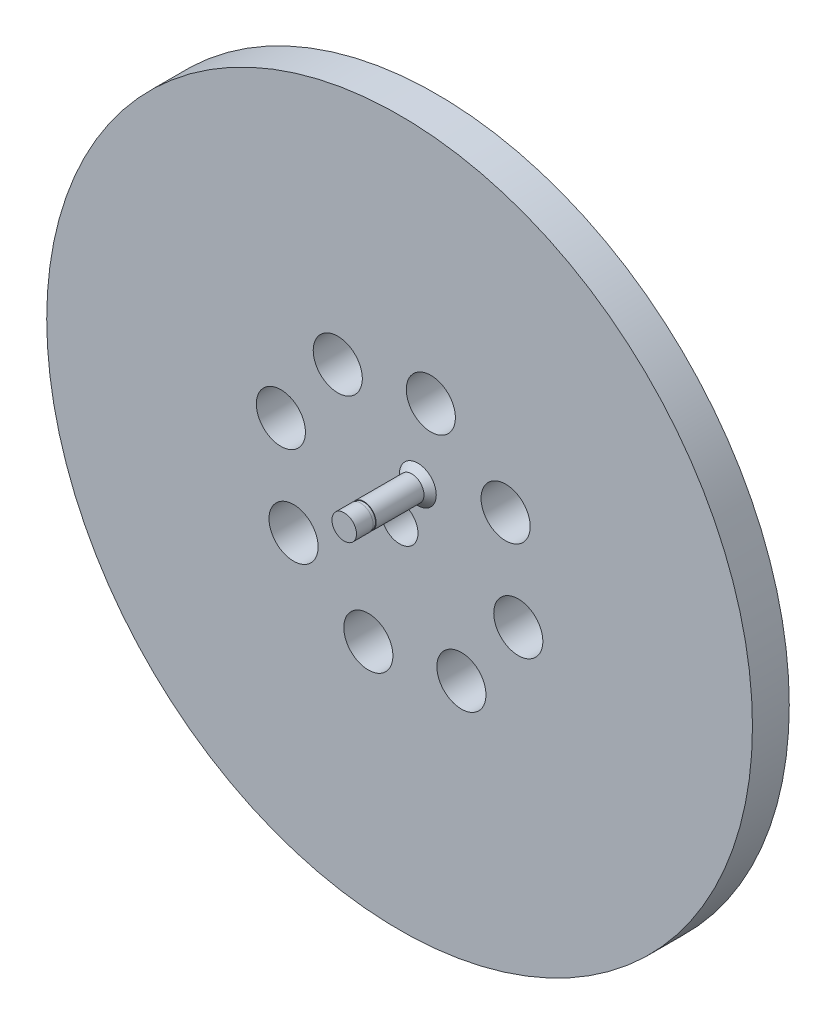
ISO-10303-21;
HEADER;
FILE_DESCRIPTION(('STEP AP214'),'2;1');
FILE_NAME('part.step','',(''),(''),'','','');
FILE_SCHEMA(('AUTOMOTIVE_DESIGN { 1 0 10303 214 1 1 1 1 }'));
ENDSEC;
DATA;
#1=APPLICATION_CONTEXT('core data for automotive mechanical design processes');
#2=APPLICATION_PROTOCOL_DEFINITION('international standard','automotive_design',2000,#1);
#3=PRODUCT_CONTEXT('',#1,'mechanical');
#4=PRODUCT('Part','Part','',(#3));
#5=PRODUCT_RELATED_PRODUCT_CATEGORY('part','',(#4));
#6=PRODUCT_DEFINITION_FORMATION('','',#4);
#7=PRODUCT_DEFINITION_CONTEXT('part definition',#1,'design');
#8=PRODUCT_DEFINITION('design','',#6,#7);
#9=PRODUCT_DEFINITION_SHAPE('','',#8);
#10=(LENGTH_UNIT() NAMED_UNIT(*) SI_UNIT(.MILLI.,.METRE.));
#11=(NAMED_UNIT(*) PLANE_ANGLE_UNIT() SI_UNIT($,.RADIAN.));
#12=(NAMED_UNIT(*) SI_UNIT($,.STERADIAN.) SOLID_ANGLE_UNIT());
#13=UNCERTAINTY_MEASURE_WITH_UNIT(LENGTH_MEASURE(1.E-05),#10,'distance_accuracy_value','');
#14=(GEOMETRIC_REPRESENTATION_CONTEXT(3) GLOBAL_UNCERTAINTY_ASSIGNED_CONTEXT((#13)) GLOBAL_UNIT_ASSIGNED_CONTEXT((#10,
#11,#12)) REPRESENTATION_CONTEXT('',''));
#15=CARTESIAN_POINT('',(0.,0.,0.));
#16=DIRECTION('',(0.,0.,1.));
#17=DIRECTION('',(1.,0.,0.));
#18=AXIS2_PLACEMENT_3D('',#15,#16,#17);
#19=CARTESIAN_POINT('',(2.97665947387337,6.88400307790459,18.));
#20=DIRECTION('',(0.,0.,-1.));
#21=DIRECTION('',(-1.,0.,0.));
#22=AXIS2_PLACEMENT_3D('',#19,#20,#21);
#23=CYLINDRICAL_SURFACE('',#22,2.);
#24=CARTESIAN_POINT('',(2.97665947387337,6.88400307790459,7.00000000000001));
#25=DIRECTION('',(0.,0.,1.));
#26=DIRECTION('',(1.,0.,0.));
#27=AXIS2_PLACEMENT_3D('',#24,#25,#26);
#28=CIRCLE('',#27,2.);
#29=CARTESIAN_POINT('',(4.97665947387337,6.88400307790459,7.00000000000001));
#30=VERTEX_POINT('',#29);
#31=EDGE_CURVE('E62',#30,#30,#28,.T.);
#32=ORIENTED_EDGE('',*,*,#31,.T.);
#33=EDGE_LOOP('',(#32));
#34=FACE_BOUND('',#33,.T.);
#35=CARTESIAN_POINT('',(2.97665947387337,6.88400307790459,14.8));
#36=DIRECTION('',(0.,0.,1.));
#37=DIRECTION('',(1.,0.,0.));
#38=AXIS2_PLACEMENT_3D('',#35,#36,#37);
#39=CIRCLE('',#38,2.);
#40=CARTESIAN_POINT('',(4.97665947387337,6.88400307790459,14.8));
#41=VERTEX_POINT('',#40);
#42=EDGE_CURVE('E159',#41,#41,#39,.T.);
#43=ORIENTED_EDGE('',*,*,#42,.F.);
#44=EDGE_LOOP('',(#43));
#45=FACE_BOUND('',#44,.T.);
#46=ADVANCED_FACE('F53',(#34,#45),#23,.T.);
#47=CARTESIAN_POINT('',(0.,0.,6.));
#48=DIRECTION('',(0.,0.,1.));
#49=DIRECTION('',(1.,0.,0.));
#50=AXIS2_PLACEMENT_3D('',#47,#48,#49);
#51=PLANE('',#50);
#52=CARTESIAN_POINT('',(2.97665947387337,6.88400307790459,6.));
#53=DIRECTION('',(0.,0.,1.));
#54=DIRECTION('',(1.,0.,0.));
#55=AXIS2_PLACEMENT_3D('',#52,#53,#54);
#56=CIRCLE('',#55,2.99999999999999);
#57=CARTESIAN_POINT('',(5.97665947387336,6.88400307790459,6.));
#58=VERTEX_POINT('',#57);
#59=EDGE_CURVE('E10',#58,#58,#56,.F.);
#60=ORIENTED_EDGE('',*,*,#59,.T.);
#61=EDGE_LOOP('',(#60));
#62=FACE_BOUND('',#61,.T.);
#63=CARTESIAN_POINT('',(17.2762876026621,10.0762039811679,6.));
#64=DIRECTION('',(0.,0.,-1.));
#65=DIRECTION('',(-1.,0.,0.));
#66=AXIS2_PLACEMENT_3D('',#63,#64,#65);
#67=CIRCLE('',#66,4.);
#68=CARTESIAN_POINT('',(13.2762876026621,10.0762039811679,6.));
#69=VERTEX_POINT('',#68);
#70=EDGE_CURVE('E99',#69,#69,#67,.T.);
#71=ORIENTED_EDGE('',*,*,#70,.T.);
#72=EDGE_LOOP('',(#71));
#73=FACE_BOUND('',#72,.T.);
#74=CARTESIAN_POINT('',(19.3411322812741,-5.0912279538688,6.));
#75=DIRECTION('',(0.,0.,-1.));
#76=DIRECTION('',(-1.,0.,0.));
#77=AXIS2_PLACEMENT_3D('',#74,#75,#76);
#78=CIRCLE('',#77,4.);
#79=CARTESIAN_POINT('',(15.3411322812741,-5.0912279538688,6.));
#80=VERTEX_POINT('',#79);
#81=EDGE_CURVE('E108',#80,#80,#78,.T.);
#82=ORIENTED_EDGE('',*,*,#81,.T.);
#83=EDGE_LOOP('',(#82));
#84=FACE_BOUND('',#83,.T.);
#85=CARTESIAN_POINT('',(10.0762039811678,-17.2762876026621,6.));
#86=DIRECTION('',(0.,0.,-1.));
#87=DIRECTION('',(-1.,0.,0.));
#88=AXIS2_PLACEMENT_3D('',#85,#86,#87);
#89=CIRCLE('',#88,4.);
#90=CARTESIAN_POINT('',(6.07620398116782,-17.2762876026621,6.));
#91=VERTEX_POINT('',#90);
#92=EDGE_CURVE('E116',#91,#91,#89,.T.);
#93=ORIENTED_EDGE('',*,*,#92,.T.);
#94=EDGE_LOOP('',(#93));
#95=FACE_BOUND('',#94,.T.);
#96=CARTESIAN_POINT('',(-5.09122795386886,-19.3411322812741,6.));
#97=DIRECTION('',(0.,0.,-1.));
#98=DIRECTION('',(-1.,0.,0.));
#99=AXIS2_PLACEMENT_3D('',#96,#97,#98);
#100=CIRCLE('',#99,4.);
#101=CARTESIAN_POINT('',(-9.09122795386886,-19.3411322812741,6.));
#102=VERTEX_POINT('',#101);
#103=EDGE_CURVE('E124',#102,#102,#100,.T.);
#104=ORIENTED_EDGE('',*,*,#103,.T.);
#105=EDGE_LOOP('',(#104));
#106=FACE_BOUND('',#105,.T.);
#107=CARTESIAN_POINT('',(-17.2762876026622,-10.0762039811678,6.));
#108=DIRECTION('',(0.,0.,-1.));
#109=DIRECTION('',(-1.,0.,0.));
#110=AXIS2_PLACEMENT_3D('',#107,#108,#109);
#111=CIRCLE('',#110,4.);
#112=CARTESIAN_POINT('',(-21.2762876026622,-10.0762039811678,6.));
#113=VERTEX_POINT('',#112);
#114=EDGE_CURVE('E132',#113,#113,#111,.T.);
#115=ORIENTED_EDGE('',*,*,#114,.T.);
#116=EDGE_LOOP('',(#115));
#117=FACE_BOUND('',#116,.T.);
#118=CARTESIAN_POINT('',(-19.3411322812741,5.09122795386893,6.));
#119=DIRECTION('',(0.,0.,-1.));
#120=DIRECTION('',(-1.,0.,0.));
#121=AXIS2_PLACEMENT_3D('',#118,#119,#120);
#122=CIRCLE('',#121,4.);
#123=CARTESIAN_POINT('',(-23.3411322812741,5.09122795386893,6.));
#124=VERTEX_POINT('',#123);
#125=EDGE_CURVE('E140',#124,#124,#122,.T.);
#126=ORIENTED_EDGE('',*,*,#125,.T.);
#127=EDGE_LOOP('',(#126));
#128=FACE_BOUND('',#127,.T.);
#129=CARTESIAN_POINT('',(-10.0762039811677,17.2762876026622,6.));
#130=DIRECTION('',(0.,0.,-1.));
#131=DIRECTION('',(-1.,0.,0.));
#132=AXIS2_PLACEMENT_3D('',#129,#130,#131);
#133=CIRCLE('',#132,4.);
#134=CARTESIAN_POINT('',(-14.0762039811677,17.2762876026622,6.));
#135=VERTEX_POINT('',#134);
#136=EDGE_CURVE('E148',#135,#135,#133,.T.);
#137=ORIENTED_EDGE('',*,*,#136,.T.);
#138=EDGE_LOOP('',(#137));
#139=FACE_BOUND('',#138,.T.);
#140=CARTESIAN_POINT('',(5.091227953869,19.3411322812741,6.));
#141=DIRECTION('',(0.,0.,-1.));
#142=DIRECTION('',(-1.,0.,0.));
#143=AXIS2_PLACEMENT_3D('',#140,#141,#142);
#144=CIRCLE('',#143,4.);
#145=CARTESIAN_POINT('',(1.091227953869,19.3411322812741,6.));
#146=VERTEX_POINT('',#145);
#147=EDGE_CURVE('E87',#146,#146,#144,.T.);
#148=ORIENTED_EDGE('',*,*,#147,.T.);
#149=EDGE_LOOP('',(#148));
#150=FACE_BOUND('',#149,.T.);
#151=CARTESIAN_POINT('',(0.,0.,6.));
#152=DIRECTION('',(0.,0.,1.));
#153=DIRECTION('',(1.,0.,0.));
#154=AXIS2_PLACEMENT_3D('',#151,#152,#153);
#155=CIRCLE('',#154,57.5);
#156=CARTESIAN_POINT('',(57.5,0.,6.));
#157=VERTEX_POINT('',#156);
#158=EDGE_CURVE('E69',#157,#157,#155,.T.);
#159=ORIENTED_EDGE('',*,*,#158,.T.);
#160=EDGE_LOOP('',(#159));
#161=FACE_BOUND('',#160,.T.);
#162=CARTESIAN_POINT('',(0.,0.,6.));
#163=DIRECTION('',(0.,0.,1.));
#164=DIRECTION('',(1.,0.,0.));
#165=AXIS2_PLACEMENT_3D('',#162,#163,#164);
#166=CIRCLE('',#165,3.);
#167=CARTESIAN_POINT('',(3.,0.,6.));
#168=VERTEX_POINT('',#167);
#169=EDGE_CURVE('E81',#168,#168,#166,.T.);
#170=ORIENTED_EDGE('',*,*,#169,.F.);
#171=EDGE_LOOP('',(#170));
#172=FACE_BOUND('',#171,.T.);
#173=ADVANCED_FACE('F198',(#62,#73,#84,#95,#106,#117,#128,#139,#150,#161,#172),#51,.T.);
#174=CARTESIAN_POINT('',(0.,0.,0.));
#175=DIRECTION('',(0.,0.,1.));
#176=DIRECTION('',(1.,0.,0.));
#177=AXIS2_PLACEMENT_3D('',#174,#175,#176);
#178=PLANE('',#177);
#179=CARTESIAN_POINT('',(17.2762876026621,10.0762039811679,0.));
#180=DIRECTION('',(0.,0.,-1.));
#181=DIRECTION('',(-1.,0.,0.));
#182=AXIS2_PLACEMENT_3D('',#179,#180,#181);
#183=CIRCLE('',#182,4.);
#184=CARTESIAN_POINT('',(13.2762876026621,10.0762039811679,0.));
#185=VERTEX_POINT('',#184);
#186=EDGE_CURVE('E103',#185,#185,#183,.T.);
#187=ORIENTED_EDGE('',*,*,#186,.F.);
#188=EDGE_LOOP('',(#187));
#189=FACE_BOUND('',#188,.T.);
#190=CARTESIAN_POINT('',(19.3411322812741,-5.0912279538688,0.));
#191=DIRECTION('',(0.,0.,-1.));
#192=DIRECTION('',(-1.,0.,0.));
#193=AXIS2_PLACEMENT_3D('',#190,#191,#192);
#194=CIRCLE('',#193,4.);
#195=CARTESIAN_POINT('',(15.3411322812741,-5.0912279538688,0.));
#196=VERTEX_POINT('',#195);
#197=EDGE_CURVE('E112',#196,#196,#194,.T.);
#198=ORIENTED_EDGE('',*,*,#197,.F.);
#199=EDGE_LOOP('',(#198));
#200=FACE_BOUND('',#199,.T.);
#201=CARTESIAN_POINT('',(10.0762039811678,-17.2762876026621,0.));
#202=DIRECTION('',(0.,0.,-1.));
#203=DIRECTION('',(-1.,0.,0.));
#204=AXIS2_PLACEMENT_3D('',#201,#202,#203);
#205=CIRCLE('',#204,4.);
#206=CARTESIAN_POINT('',(6.07620398116782,-17.2762876026621,0.));
#207=VERTEX_POINT('',#206);
#208=EDGE_CURVE('E120',#207,#207,#205,.T.);
#209=ORIENTED_EDGE('',*,*,#208,.F.);
#210=EDGE_LOOP('',(#209));
#211=FACE_BOUND('',#210,.T.);
#212=CARTESIAN_POINT('',(-5.09122795386886,-19.3411322812741,0.));
#213=DIRECTION('',(0.,0.,-1.));
#214=DIRECTION('',(-1.,0.,0.));
#215=AXIS2_PLACEMENT_3D('',#212,#213,#214);
#216=CIRCLE('',#215,4.);
#217=CARTESIAN_POINT('',(-9.09122795386886,-19.3411322812741,0.));
#218=VERTEX_POINT('',#217);
#219=EDGE_CURVE('E128',#218,#218,#216,.T.);
#220=ORIENTED_EDGE('',*,*,#219,.F.);
#221=EDGE_LOOP('',(#220));
#222=FACE_BOUND('',#221,.T.);
#223=CARTESIAN_POINT('',(-17.2762876026622,-10.0762039811678,0.));
#224=DIRECTION('',(0.,0.,-1.));
#225=DIRECTION('',(-1.,0.,0.));
#226=AXIS2_PLACEMENT_3D('',#223,#224,#225);
#227=CIRCLE('',#226,4.);
#228=CARTESIAN_POINT('',(-21.2762876026622,-10.0762039811678,0.));
#229=VERTEX_POINT('',#228);
#230=EDGE_CURVE('E136',#229,#229,#227,.T.);
#231=ORIENTED_EDGE('',*,*,#230,.F.);
#232=EDGE_LOOP('',(#231));
#233=FACE_BOUND('',#232,.T.);
#234=CARTESIAN_POINT('',(-19.3411322812741,5.09122795386893,0.));
#235=DIRECTION('',(0.,0.,-1.));
#236=DIRECTION('',(-1.,0.,0.));
#237=AXIS2_PLACEMENT_3D('',#234,#235,#236);
#238=CIRCLE('',#237,4.);
#239=CARTESIAN_POINT('',(-23.3411322812741,5.09122795386893,0.));
#240=VERTEX_POINT('',#239);
#241=EDGE_CURVE('E144',#240,#240,#238,.T.);
#242=ORIENTED_EDGE('',*,*,#241,.F.);
#243=EDGE_LOOP('',(#242));
#244=FACE_BOUND('',#243,.T.);
#245=CARTESIAN_POINT('',(-10.0762039811677,17.2762876026622,0.));
#246=DIRECTION('',(0.,0.,-1.));
#247=DIRECTION('',(-1.,0.,0.));
#248=AXIS2_PLACEMENT_3D('',#245,#246,#247);
#249=CIRCLE('',#248,4.);
#250=CARTESIAN_POINT('',(-14.0762039811677,17.2762876026622,0.));
#251=VERTEX_POINT('',#250);
#252=EDGE_CURVE('E95',#251,#251,#249,.T.);
#253=ORIENTED_EDGE('',*,*,#252,.F.);
#254=EDGE_LOOP('',(#253));
#255=FACE_BOUND('',#254,.T.);
#256=CARTESIAN_POINT('',(5.091227953869,19.3411322812741,0.));
#257=DIRECTION('',(0.,0.,-1.));
#258=DIRECTION('',(-1.,0.,0.));
#259=AXIS2_PLACEMENT_3D('',#256,#257,#258);
#260=CIRCLE('',#259,4.);
#261=CARTESIAN_POINT('',(1.091227953869,19.3411322812741,0.));
#262=VERTEX_POINT('',#261);
#263=EDGE_CURVE('E91',#262,#262,#260,.T.);
#264=ORIENTED_EDGE('',*,*,#263,.F.);
#265=EDGE_LOOP('',(#264));
#266=FACE_BOUND('',#265,.T.);
#267=CARTESIAN_POINT('',(0.,0.,0.));
#268=DIRECTION('',(0.,0.,1.));
#269=DIRECTION('',(1.,0.,0.));
#270=AXIS2_PLACEMENT_3D('',#267,#268,#269);
#271=CIRCLE('',#270,57.5);
#272=CARTESIAN_POINT('',(57.5,0.,0.));
#273=VERTEX_POINT('',#272);
#274=EDGE_CURVE('E76',#273,#273,#271,.T.);
#275=ORIENTED_EDGE('',*,*,#274,.F.);
#276=EDGE_LOOP('',(#275));
#277=FACE_BOUND('',#276,.T.);
#278=CARTESIAN_POINT('',(0.,0.,0.));
#279=DIRECTION('',(0.,0.,1.));
#280=DIRECTION('',(1.,0.,0.));
#281=AXIS2_PLACEMENT_3D('',#278,#279,#280);
#282=CIRCLE('',#281,3.);
#283=CARTESIAN_POINT('',(3.,0.,0.));
#284=VERTEX_POINT('',#283);
#285=EDGE_CURVE('E83',#284,#284,#282,.T.);
#286=ORIENTED_EDGE('',*,*,#285,.T.);
#287=EDGE_LOOP('',(#286));
#288=FACE_BOUND('',#287,.T.);
#289=ADVANCED_FACE('F206',(#189,#200,#211,#222,#233,#244,#255,#266,#277,#288),#178,.F.);
#290=CARTESIAN_POINT('',(0.,0.,6.));
#291=DIRECTION('',(0.,0.,-1.));
#292=DIRECTION('',(-1.,0.,0.));
#293=AXIS2_PLACEMENT_3D('',#290,#291,#292);
#294=CYLINDRICAL_SURFACE('',#293,57.5);
#295=ORIENTED_EDGE('',*,*,#158,.F.);
#296=EDGE_LOOP('',(#295));
#297=FACE_BOUND('',#296,.T.);
#298=ORIENTED_EDGE('',*,*,#274,.T.);
#299=EDGE_LOOP('',(#298));
#300=FACE_BOUND('',#299,.T.);
#301=ADVANCED_FACE('F268',(#297,#300),#294,.T.);
#302=CARTESIAN_POINT('',(0.,0.,6.));
#303=DIRECTION('',(0.,0.,-1.));
#304=DIRECTION('',(-1.,0.,0.));
#305=AXIS2_PLACEMENT_3D('',#302,#303,#304);
#306=CYLINDRICAL_SURFACE('',#305,3.);
#307=ORIENTED_EDGE('',*,*,#169,.T.);
#308=EDGE_LOOP('',(#307));
#309=FACE_BOUND('',#308,.T.);
#310=ORIENTED_EDGE('',*,*,#285,.F.);
#311=EDGE_LOOP('',(#310));
#312=FACE_BOUND('',#311,.T.);
#313=ADVANCED_FACE('F279',(#309,#312),#306,.F.);
#314=CARTESIAN_POINT('',(5.091227953869,19.3411322812741,6.));
#315=DIRECTION('',(0.,0.,-1.));
#316=DIRECTION('',(-1.,0.,0.));
#317=AXIS2_PLACEMENT_3D('',#314,#315,#316);
#318=CYLINDRICAL_SURFACE('',#317,4.);
#319=ORIENTED_EDGE('',*,*,#147,.F.);
#320=EDGE_LOOP('',(#319));
#321=FACE_BOUND('',#320,.T.);
#322=ORIENTED_EDGE('',*,*,#263,.T.);
#323=EDGE_LOOP('',(#322));
#324=FACE_BOUND('',#323,.T.);
#325=ADVANCED_FACE('F286',(#321,#324),#318,.F.);
#326=CARTESIAN_POINT('',(-10.0762039811677,17.2762876026622,6.));
#327=DIRECTION('',(0.,0.,-1.));
#328=DIRECTION('',(-1.,0.,0.));
#329=AXIS2_PLACEMENT_3D('',#326,#327,#328);
#330=CYLINDRICAL_SURFACE('',#329,4.);
#331=ORIENTED_EDGE('',*,*,#136,.F.);
#332=EDGE_LOOP('',(#331));
#333=FACE_BOUND('',#332,.T.);
#334=ORIENTED_EDGE('',*,*,#252,.T.);
#335=EDGE_LOOP('',(#334));
#336=FACE_BOUND('',#335,.T.);
#337=ADVANCED_FACE('F304',(#333,#336),#330,.F.);
#338=CARTESIAN_POINT('',(-19.3411322812741,5.09122795386893,6.));
#339=DIRECTION('',(0.,0.,-1.));
#340=DIRECTION('',(-1.,0.,0.));
#341=AXIS2_PLACEMENT_3D('',#338,#339,#340);
#342=CYLINDRICAL_SURFACE('',#341,4.);
#343=ORIENTED_EDGE('',*,*,#125,.F.);
#344=EDGE_LOOP('',(#343));
#345=FACE_BOUND('',#344,.T.);
#346=ORIENTED_EDGE('',*,*,#241,.T.);
#347=EDGE_LOOP('',(#346));
#348=FACE_BOUND('',#347,.T.);
#349=ADVANCED_FACE('F314',(#345,#348),#342,.F.);
#350=CARTESIAN_POINT('',(-17.2762876026622,-10.0762039811678,6.));
#351=DIRECTION('',(0.,0.,-1.));
#352=DIRECTION('',(-1.,0.,0.));
#353=AXIS2_PLACEMENT_3D('',#350,#351,#352);
#354=CYLINDRICAL_SURFACE('',#353,4.);
#355=ORIENTED_EDGE('',*,*,#114,.F.);
#356=EDGE_LOOP('',(#355));
#357=FACE_BOUND('',#356,.T.);
#358=ORIENTED_EDGE('',*,*,#230,.T.);
#359=EDGE_LOOP('',(#358));
#360=FACE_BOUND('',#359,.T.);
#361=ADVANCED_FACE('F323',(#357,#360),#354,.F.);
#362=CARTESIAN_POINT('',(-5.09122795386886,-19.3411322812741,6.));
#363=DIRECTION('',(0.,0.,-1.));
#364=DIRECTION('',(-1.,0.,0.));
#365=AXIS2_PLACEMENT_3D('',#362,#363,#364);
#366=CYLINDRICAL_SURFACE('',#365,4.);
#367=ORIENTED_EDGE('',*,*,#103,.F.);
#368=EDGE_LOOP('',(#367));
#369=FACE_BOUND('',#368,.T.);
#370=ORIENTED_EDGE('',*,*,#219,.T.);
#371=EDGE_LOOP('',(#370));
#372=FACE_BOUND('',#371,.T.);
#373=ADVANCED_FACE('F333',(#369,#372),#366,.F.);
#374=CARTESIAN_POINT('',(10.0762039811678,-17.2762876026621,6.));
#375=DIRECTION('',(0.,0.,-1.));
#376=DIRECTION('',(-1.,0.,0.));
#377=AXIS2_PLACEMENT_3D('',#374,#375,#376);
#378=CYLINDRICAL_SURFACE('',#377,4.);
#379=ORIENTED_EDGE('',*,*,#92,.F.);
#380=EDGE_LOOP('',(#379));
#381=FACE_BOUND('',#380,.T.);
#382=ORIENTED_EDGE('',*,*,#208,.T.);
#383=EDGE_LOOP('',(#382));
#384=FACE_BOUND('',#383,.T.);
#385=ADVANCED_FACE('F343',(#381,#384),#378,.F.);
#386=CARTESIAN_POINT('',(19.3411322812741,-5.0912279538688,6.));
#387=DIRECTION('',(0.,0.,-1.));
#388=DIRECTION('',(-1.,0.,0.));
#389=AXIS2_PLACEMENT_3D('',#386,#387,#388);
#390=CYLINDRICAL_SURFACE('',#389,4.);
#391=ORIENTED_EDGE('',*,*,#81,.F.);
#392=EDGE_LOOP('',(#391));
#393=FACE_BOUND('',#392,.T.);
#394=ORIENTED_EDGE('',*,*,#197,.T.);
#395=EDGE_LOOP('',(#394));
#396=FACE_BOUND('',#395,.T.);
#397=ADVANCED_FACE('F353',(#393,#396),#390,.F.);
#398=CARTESIAN_POINT('',(17.2762876026621,10.0762039811679,6.));
#399=DIRECTION('',(0.,0.,-1.));
#400=DIRECTION('',(-1.,0.,0.));
#401=AXIS2_PLACEMENT_3D('',#398,#399,#400);
#402=CYLINDRICAL_SURFACE('',#401,4.);
#403=ORIENTED_EDGE('',*,*,#70,.F.);
#404=EDGE_LOOP('',(#403));
#405=FACE_BOUND('',#404,.T.);
#406=ORIENTED_EDGE('',*,*,#186,.T.);
#407=EDGE_LOOP('',(#406));
#408=FACE_BOUND('',#407,.T.);
#409=ADVANCED_FACE('F193',(#405,#408),#402,.F.);
#410=CARTESIAN_POINT('',(2.97665947387337,6.88400307790459,15.3));
#411=DIRECTION('',(0.,0.,1.));
#412=DIRECTION('',(1.,0.,0.));
#413=AXIS2_PLACEMENT_3D('',#410,#411,#412);
#414=PLANE('',#413);
#415=CARTESIAN_POINT('',(2.97665947387337,6.88400307790459,15.3));
#416=DIRECTION('',(0.,0.,1.));
#417=DIRECTION('',(1.,0.,0.));
#418=AXIS2_PLACEMENT_3D('',#415,#416,#417);
#419=CIRCLE('',#418,2.);
#420=CARTESIAN_POINT('',(4.97665947387337,6.88400307790459,15.3));
#421=VERTEX_POINT('',#420);
#422=EDGE_CURVE('E158',#421,#421,#419,.T.);
#423=ORIENTED_EDGE('',*,*,#422,.F.);
#424=EDGE_LOOP('',(#423));
#425=FACE_BOUND('',#424,.T.);
#426=CARTESIAN_POINT('',(2.97665947387337,6.88400307790459,15.3));
#427=DIRECTION('',(0.,0.,1.));
#428=DIRECTION('',(1.,0.,0.));
#429=AXIS2_PLACEMENT_3D('',#426,#427,#428);
#430=CIRCLE('',#429,1.9);
#431=CARTESIAN_POINT('',(4.87665947387337,6.88400307790459,15.3));
#432=VERTEX_POINT('',#431);
#433=EDGE_CURVE('E163',#432,#432,#430,.T.);
#434=ORIENTED_EDGE('',*,*,#433,.T.);
#435=EDGE_LOOP('',(#434));
#436=FACE_BOUND('',#435,.T.);
#437=ADVANCED_FACE('F177',(#425,#436),#414,.F.);
#438=CARTESIAN_POINT('',(2.97665947387337,6.88400307790459,14.8));
#439=DIRECTION('',(0.,0.,1.));
#440=DIRECTION('',(1.,0.,0.));
#441=AXIS2_PLACEMENT_3D('',#438,#439,#440);
#442=PLANE('',#441);
#443=ORIENTED_EDGE('',*,*,#42,.T.);
#444=EDGE_LOOP('',(#443));
#445=FACE_BOUND('',#444,.T.);
#446=CARTESIAN_POINT('',(2.97665947387337,6.88400307790459,14.8));
#447=DIRECTION('',(0.,0.,1.));
#448=DIRECTION('',(1.,0.,0.));
#449=AXIS2_PLACEMENT_3D('',#446,#447,#448);
#450=CIRCLE('',#449,1.9);
#451=CARTESIAN_POINT('',(4.87665947387337,6.88400307790459,14.8));
#452=VERTEX_POINT('',#451);
#453=EDGE_CURVE('E167',#452,#452,#450,.T.);
#454=ORIENTED_EDGE('',*,*,#453,.F.);
#455=EDGE_LOOP('',(#454));
#456=FACE_BOUND('',#455,.T.);
#457=ADVANCED_FACE('F183',(#445,#456),#442,.T.);
#458=CARTESIAN_POINT('',(2.97665947387337,6.88400307790459,15.3));
#459=DIRECTION('',(0.,0.,-1.));
#460=DIRECTION('',(-1.,0.,0.));
#461=AXIS2_PLACEMENT_3D('',#458,#459,#460);
#462=CYLINDRICAL_SURFACE('',#461,1.9);
#463=ORIENTED_EDGE('',*,*,#433,.F.);
#464=EDGE_LOOP('',(#463));
#465=FACE_BOUND('',#464,.T.);
#466=ORIENTED_EDGE('',*,*,#453,.T.);
#467=EDGE_LOOP('',(#466));
#468=FACE_BOUND('',#467,.T.);
#469=ADVANCED_FACE('F179',(#465,#468),#462,.T.);
#470=CARTESIAN_POINT('',(2.97665947387337,6.88400307790459,18.));
#471=DIRECTION('',(0.,0.,1.));
#472=DIRECTION('',(1.,0.,0.));
#473=AXIS2_PLACEMENT_3D('',#470,#471,#472);
#474=PLANE('',#473);
#475=CARTESIAN_POINT('',(2.97665947387337,6.88400307790459,18.));
#476=DIRECTION('',(0.,0.,1.));
#477=DIRECTION('',(1.,0.,0.));
#478=AXIS2_PLACEMENT_3D('',#475,#476,#477);
#479=CIRCLE('',#478,2.);
#480=CARTESIAN_POINT('',(4.97665947387337,6.88400307790459,18.));
#481=VERTEX_POINT('',#480);
#482=EDGE_CURVE('E104',#481,#481,#479,.T.);
#483=ORIENTED_EDGE('',*,*,#482,.T.);
#484=EDGE_LOOP('',(#483));
#485=FACE_BOUND('',#484,.T.);
#486=ADVANCED_FACE('F182',(#485),#474,.T.);
#487=ORIENTED_EDGE('',*,*,#422,.T.);
#488=EDGE_LOOP('',(#487));
#489=FACE_BOUND('',#488,.T.);
#490=ORIENTED_EDGE('',*,*,#482,.F.);
#491=EDGE_LOOP('',(#490));
#492=FACE_BOUND('',#491,.T.);
#493=ADVANCED_FACE('F200',(#489,#492),#23,.T.);
#494=CARTESIAN_POINT('',(2.97665947387337,6.88400307790459,7.00000000000001));
#495=DIRECTION('',(0.,0.,-1.));
#496=DIRECTION('',(-1.,0.,0.));
#497=AXIS2_PLACEMENT_3D('',#494,#495,#496);
#498=CONICAL_SURFACE('',#497,2.,0.785398163397438);
#499=ORIENTED_EDGE('',*,*,#59,.F.);
#500=EDGE_LOOP('',(#499));
#501=FACE_BOUND('',#500,.T.);
#502=ORIENTED_EDGE('',*,*,#31,.F.);
#503=EDGE_LOOP('',(#502));
#504=FACE_BOUND('',#503,.T.);
#505=ADVANCED_FACE('F56',(#501,#504),#498,.T.);
#506=CLOSED_SHELL('',(#46,#173,#289,#301,#313,#325,#337,#349,#361,#373,#385,#397,#409,#437,#457,
#469,#486,#493,#505));
#507=MANIFOLD_SOLID_BREP('B2',#506);
#508=ADVANCED_BREP_SHAPE_REPRESENTATION('',(#18,#507),#14);
#509=SHAPE_DEFINITION_REPRESENTATION(#9,#508);
ENDSEC;
END-ISO-10303-21;
